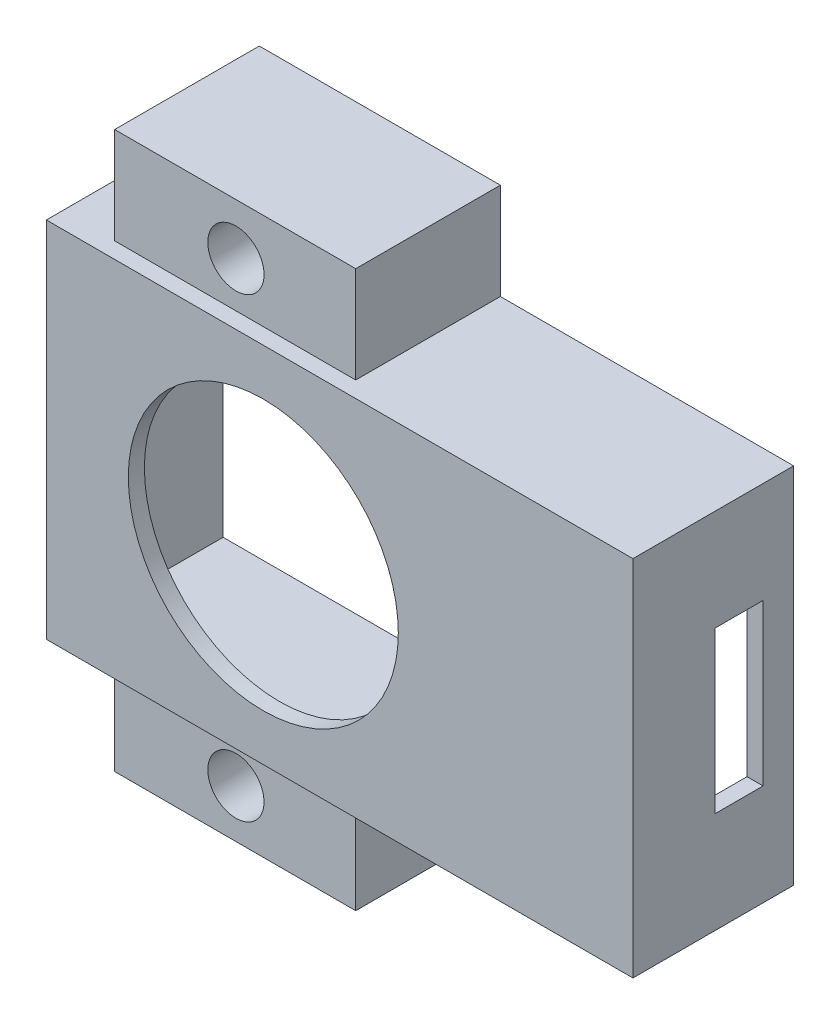
ISO-10303-21;
HEADER;
FILE_DESCRIPTION(('STEP AP214'),'2;1');
FILE_NAME('part.step','',(''),(''),'','','');
FILE_SCHEMA(('AUTOMOTIVE_DESIGN { 1 0 10303 214 1 1 1 1 }'));
ENDSEC;
DATA;
#1=APPLICATION_CONTEXT('core data for automotive mechanical design processes');
#2=APPLICATION_PROTOCOL_DEFINITION('international standard','automotive_design',2000,#1);
#3=PRODUCT_CONTEXT('',#1,'mechanical');
#4=PRODUCT('Part','Part','',(#3));
#5=PRODUCT_RELATED_PRODUCT_CATEGORY('part','',(#4));
#6=PRODUCT_DEFINITION_FORMATION('','',#4);
#7=PRODUCT_DEFINITION_CONTEXT('part definition',#1,'design');
#8=PRODUCT_DEFINITION('design','',#6,#7);
#9=PRODUCT_DEFINITION_SHAPE('','',#8);
#10=(LENGTH_UNIT() NAMED_UNIT(*) SI_UNIT(.MILLI.,.METRE.));
#11=(NAMED_UNIT(*) PLANE_ANGLE_UNIT() SI_UNIT($,.RADIAN.));
#12=(NAMED_UNIT(*) SI_UNIT($,.STERADIAN.) SOLID_ANGLE_UNIT());
#13=UNCERTAINTY_MEASURE_WITH_UNIT(LENGTH_MEASURE(1.E-05),#10,'distance_accuracy_value','');
#14=(GEOMETRIC_REPRESENTATION_CONTEXT(3) GLOBAL_UNCERTAINTY_ASSIGNED_CONTEXT((#13)) GLOBAL_UNIT_ASSIGNED_CONTEXT((#10,
#11,#12)) REPRESENTATION_CONTEXT('',''));
#15=CARTESIAN_POINT('',(0.,0.,0.));
#16=DIRECTION('',(0.,0.,1.));
#17=DIRECTION('',(1.,0.,0.));
#18=AXIS2_PLACEMENT_3D('',#15,#16,#17);
#19=CARTESIAN_POINT('',(0.,0.,0.));
#20=DIRECTION('',(0.,0.,-1.));
#21=DIRECTION('',(-1.,0.,0.));
#22=AXIS2_PLACEMENT_3D('',#19,#20,#21);
#23=PLANE('',#22);
#24=CARTESIAN_POINT('',(-7.45529442150943,14.124015169324,0.));
#25=DIRECTION('',(0.,0.,-1.));
#26=DIRECTION('',(-1.,0.,0.));
#27=AXIS2_PLACEMENT_3D('',#24,#25,#26);
#28=CIRCLE('',#27,1.75);
#29=CARTESIAN_POINT('',(-9.20529442150943,14.124015169324,0.));
#30=VERTEX_POINT('',#29);
#31=EDGE_CURVE('E390',#30,#30,#28,.T.);
#32=ORIENTED_EDGE('',*,*,#31,.F.);
#33=EDGE_LOOP('',(#32));
#34=FACE_BOUND('',#33,.T.);
#35=CARTESIAN_POINT('',(-7.45529442150943,-14.2961675918663,0.));
#36=DIRECTION('',(0.,0.,-1.));
#37=DIRECTION('',(-1.,0.,0.));
#38=AXIS2_PLACEMENT_3D('',#35,#36,#37);
#39=CIRCLE('',#38,1.75);
#40=CARTESIAN_POINT('',(-9.20529442150943,-14.2961675918663,0.));
#41=VERTEX_POINT('',#40);
#42=EDGE_CURVE('E397',#41,#41,#39,.T.);
#43=ORIENTED_EDGE('',*,*,#42,.F.);
#44=EDGE_LOOP('',(#43));
#45=FACE_BOUND('',#44,.T.);
#46=DIRECTION('',(0.,1.,0.));
#47=VECTOR('',#46,1.);
#48=CARTESIAN_POINT('',(18.25,-11.3,0.));
#49=LINE('',#48,#47);
#50=CARTESIAN_POINT('',(18.25,-11.3,0.));
#51=VERTEX_POINT('',#50);
#52=CARTESIAN_POINT('',(18.25,11.3,0.));
#53=VERTEX_POINT('',#52);
#54=EDGE_CURVE('E294',#51,#53,#49,.T.);
#55=ORIENTED_EDGE('',*,*,#54,.F.);
#56=DIRECTION('',(1.,0.,0.));
#57=VECTOR('',#56,1.);
#58=CARTESIAN_POINT('',(-18.25,-11.3,0.));
#59=LINE('',#58,#57);
#60=CARTESIAN_POINT('',(0.,-11.3,0.));
#61=VERTEX_POINT('',#60);
#62=EDGE_CURVE('E202',#61,#51,#59,.T.);
#63=ORIENTED_EDGE('',*,*,#62,.F.);
#64=DIRECTION('',(0.,-1.,0.));
#65=VECTOR('',#64,1.);
#66=CARTESIAN_POINT('',(0.,-11.3,0.));
#67=LINE('',#66,#65);
#68=CARTESIAN_POINT('',(0.,-17.3,0.));
#69=VERTEX_POINT('',#68);
#70=EDGE_CURVE('E189',#61,#69,#67,.T.);
#71=ORIENTED_EDGE('',*,*,#70,.T.);
#72=DIRECTION('',(-1.,0.,0.));
#73=VECTOR('',#72,1.);
#74=CARTESIAN_POINT('',(0.,-17.3,0.));
#75=LINE('',#74,#73);
#76=CARTESIAN_POINT('',(-15.,-17.3,0.));
#77=VERTEX_POINT('',#76);
#78=EDGE_CURVE('E177',#69,#77,#75,.T.);
#79=ORIENTED_EDGE('',*,*,#78,.T.);
#80=DIRECTION('',(0.,1.,0.));
#81=VECTOR('',#80,1.);
#82=CARTESIAN_POINT('',(-15.,-11.3,0.));
#83=LINE('',#82,#81);
#84=CARTESIAN_POINT('',(-15.,-11.3,0.));
#85=VERTEX_POINT('',#84);
#86=EDGE_CURVE('E188',#77,#85,#83,.T.);
#87=ORIENTED_EDGE('',*,*,#86,.T.);
#88=CARTESIAN_POINT('',(-18.25,-11.3,0.));
#89=VERTEX_POINT('',#88);
#90=EDGE_CURVE('E339',#89,#85,#59,.T.);
#91=ORIENTED_EDGE('',*,*,#90,.F.);
#92=DIRECTION('',(0.,-1.,0.));
#93=VECTOR('',#92,1.);
#94=CARTESIAN_POINT('',(-18.25,-11.3,0.));
#95=LINE('',#94,#93);
#96=CARTESIAN_POINT('',(-18.25,11.3,0.));
#97=VERTEX_POINT('',#96);
#98=EDGE_CURVE('E356',#97,#89,#95,.T.);
#99=ORIENTED_EDGE('',*,*,#98,.F.);
#100=DIRECTION('',(-1.,0.,0.));
#101=VECTOR('',#100,1.);
#102=CARTESIAN_POINT('',(-18.25,11.3,0.));
#103=LINE('',#102,#101);
#104=CARTESIAN_POINT('',(-15.,11.3,0.));
#105=VERTEX_POINT('',#104);
#106=EDGE_CURVE('E352',#105,#97,#103,.T.);
#107=ORIENTED_EDGE('',*,*,#106,.F.);
#108=DIRECTION('',(0.,1.,0.));
#109=VECTOR('',#108,1.);
#110=CARTESIAN_POINT('',(-15.,11.3,0.));
#111=LINE('',#110,#109);
#112=CARTESIAN_POINT('',(-15.,17.3,0.));
#113=VERTEX_POINT('',#112);
#114=EDGE_CURVE('E237',#105,#113,#111,.T.);
#115=ORIENTED_EDGE('',*,*,#114,.T.);
#116=DIRECTION('',(1.,0.,0.));
#117=VECTOR('',#116,1.);
#118=CARTESIAN_POINT('',(0.,17.3,0.));
#119=LINE('',#118,#117);
#120=CARTESIAN_POINT('',(0.,17.3,0.));
#121=VERTEX_POINT('',#120);
#122=EDGE_CURVE('E221',#113,#121,#119,.T.);
#123=ORIENTED_EDGE('',*,*,#122,.T.);
#124=DIRECTION('',(0.,-1.,0.));
#125=VECTOR('',#124,1.);
#126=CARTESIAN_POINT('',(0.,11.3,0.));
#127=LINE('',#126,#125);
#128=CARTESIAN_POINT('',(0.,11.3,0.));
#129=VERTEX_POINT('',#128);
#130=EDGE_CURVE('E242',#121,#129,#127,.T.);
#131=ORIENTED_EDGE('',*,*,#130,.T.);
#132=EDGE_CURVE('E353',#53,#129,#103,.T.);
#133=ORIENTED_EDGE('',*,*,#132,.F.);
#134=EDGE_LOOP('',(#55,#63,#71,#79,#87,#91,#99,#107,#115,#123,#131,#133));
#135=FACE_BOUND('',#134,.T.);
#136=DIRECTION('',(1.,0.,0.));
#137=VECTOR('',#136,1.);
#138=CARTESIAN_POINT('',(0.,-10.3,0.));
#139=LINE('',#138,#137);
#140=CARTESIAN_POINT('',(-17.25,-10.3,0.));
#141=VERTEX_POINT('',#140);
#142=CARTESIAN_POINT('',(17.25,-10.3,0.));
#143=VERTEX_POINT('',#142);
#144=EDGE_CURVE('E301',#141,#143,#139,.T.);
#145=ORIENTED_EDGE('',*,*,#144,.T.);
#146=DIRECTION('',(0.,1.,0.));
#147=VECTOR('',#146,1.);
#148=CARTESIAN_POINT('',(17.25,0.,0.));
#149=LINE('',#148,#147);
#150=CARTESIAN_POINT('',(17.25,10.3,0.));
#151=VERTEX_POINT('',#150);
#152=EDGE_CURVE('E319',#143,#151,#149,.T.);
#153=ORIENTED_EDGE('',*,*,#152,.T.);
#154=DIRECTION('',(-1.,0.,0.));
#155=VECTOR('',#154,1.);
#156=CARTESIAN_POINT('',(0.,10.3,0.));
#157=LINE('',#156,#155);
#158=CARTESIAN_POINT('',(-17.25,10.3,0.));
#159=VERTEX_POINT('',#158);
#160=EDGE_CURVE('E323',#151,#159,#157,.T.);
#161=ORIENTED_EDGE('',*,*,#160,.T.);
#162=DIRECTION('',(0.,-1.,0.));
#163=VECTOR('',#162,1.);
#164=CARTESIAN_POINT('',(-17.25,0.,0.));
#165=LINE('',#164,#163);
#166=EDGE_CURVE('E327',#159,#141,#165,.T.);
#167=ORIENTED_EDGE('',*,*,#166,.T.);
#168=EDGE_LOOP('',(#145,#153,#161,#167));
#169=FACE_BOUND('',#168,.T.);
#170=ADVANCED_FACE('F39',(#34,#45,#135,#169),#23,.T.);
#171=CARTESIAN_POINT('',(18.25,-11.3,10.));
#172=DIRECTION('',(-1.,0.,0.));
#173=DIRECTION('',(0.,0.,1.));
#174=AXIS2_PLACEMENT_3D('',#171,#172,#173);
#175=PLANE('',#174);
#176=DIRECTION('',(0.,0.,-1.));
#177=VECTOR('',#176,1.);
#178=CARTESIAN_POINT('',(18.25,-5.,1.9));
#179=LINE('',#178,#177);
#180=CARTESIAN_POINT('',(18.25,-5.,4.9));
#181=VERTEX_POINT('',#180);
#182=CARTESIAN_POINT('',(18.25,-5.,1.9));
#183=VERTEX_POINT('',#182);
#184=EDGE_CURVE('E260',#181,#183,#179,.T.);
#185=ORIENTED_EDGE('',*,*,#184,.F.);
#186=DIRECTION('',(0.,-1.,0.));
#187=VECTOR('',#186,1.);
#188=CARTESIAN_POINT('',(18.25,-5.,4.9));
#189=LINE('',#188,#187);
#190=CARTESIAN_POINT('',(18.25,5.,4.9));
#191=VERTEX_POINT('',#190);
#192=EDGE_CURVE('E241',#191,#181,#189,.T.);
#193=ORIENTED_EDGE('',*,*,#192,.F.);
#194=DIRECTION('',(0.,0.,1.));
#195=VECTOR('',#194,1.);
#196=CARTESIAN_POINT('',(18.25,5.,1.9));
#197=LINE('',#196,#195);
#198=CARTESIAN_POINT('',(18.25,5.,1.9));
#199=VERTEX_POINT('',#198);
#200=EDGE_CURVE('E268',#199,#191,#197,.T.);
#201=ORIENTED_EDGE('',*,*,#200,.F.);
#202=DIRECTION('',(0.,1.,0.));
#203=VECTOR('',#202,1.);
#204=CARTESIAN_POINT('',(18.25,-5.,1.9));
#205=LINE('',#204,#203);
#206=EDGE_CURVE('E264',#183,#199,#205,.T.);
#207=ORIENTED_EDGE('',*,*,#206,.F.);
#208=EDGE_LOOP('',(#185,#193,#201,#207));
#209=FACE_BOUND('',#208,.T.);
#210=ORIENTED_EDGE('',*,*,#54,.T.);
#211=DIRECTION('',(0.,0.,-1.));
#212=VECTOR('',#211,1.);
#213=CARTESIAN_POINT('',(18.25,11.3,10.));
#214=LINE('',#213,#212);
#215=CARTESIAN_POINT('',(18.25,11.3,10.));
#216=VERTEX_POINT('',#215);
#217=EDGE_CURVE('E372',#216,#53,#214,.T.);
#218=ORIENTED_EDGE('',*,*,#217,.F.);
#219=DIRECTION('',(0.,1.,0.));
#220=VECTOR('',#219,1.);
#221=CARTESIAN_POINT('',(18.25,-11.3,10.));
#222=LINE('',#221,#220);
#223=CARTESIAN_POINT('',(18.25,-11.3,10.));
#224=VERTEX_POINT('',#223);
#225=EDGE_CURVE('E334',#224,#216,#222,.T.);
#226=ORIENTED_EDGE('',*,*,#225,.F.);
#227=DIRECTION('',(0.,0.,-1.));
#228=VECTOR('',#227,1.);
#229=CARTESIAN_POINT('',(18.25,-11.3,10.));
#230=LINE('',#229,#228);
#231=EDGE_CURVE('E348',#224,#51,#230,.T.);
#232=ORIENTED_EDGE('',*,*,#231,.T.);
#233=EDGE_LOOP('',(#210,#218,#226,#232));
#234=FACE_BOUND('',#233,.T.);
#235=ADVANCED_FACE('F41',(#209,#234),#175,.F.);
#236=CARTESIAN_POINT('',(-18.25,11.3,10.));
#237=DIRECTION('',(0.,-1.,0.));
#238=DIRECTION('',(0.,0.,-1.));
#239=AXIS2_PLACEMENT_3D('',#236,#237,#238);
#240=PLANE('',#239);
#241=ORIENTED_EDGE('',*,*,#132,.T.);
#242=DIRECTION('',(0.,0.,1.));
#243=VECTOR('',#242,1.);
#244=CARTESIAN_POINT('',(0.,11.3,-16.1554944214035));
#245=LINE('',#244,#243);
#246=CARTESIAN_POINT('',(0.,11.3,9.));
#247=VERTEX_POINT('',#246);
#248=EDGE_CURVE('E231',#129,#247,#245,.T.);
#249=ORIENTED_EDGE('',*,*,#248,.T.);
#250=DIRECTION('',(-1.,0.,0.));
#251=VECTOR('',#250,1.);
#252=CARTESIAN_POINT('',(0.,11.3,9.));
#253=LINE('',#252,#251);
#254=CARTESIAN_POINT('',(-15.,11.3,9.));
#255=VERTEX_POINT('',#254);
#256=EDGE_CURVE('E228',#247,#255,#253,.T.);
#257=ORIENTED_EDGE('',*,*,#256,.T.);
#258=DIRECTION('',(0.,0.,1.));
#259=VECTOR('',#258,1.);
#260=CARTESIAN_POINT('',(-15.,11.3,-16.1554944214035));
#261=LINE('',#260,#259);
#262=EDGE_CURVE('E227',#105,#255,#261,.T.);
#263=ORIENTED_EDGE('',*,*,#262,.F.);
#264=ORIENTED_EDGE('',*,*,#106,.T.);
#265=DIRECTION('',(0.,0.,-1.));
#266=VECTOR('',#265,1.);
#267=CARTESIAN_POINT('',(-18.25,11.3,10.));
#268=LINE('',#267,#266);
#269=CARTESIAN_POINT('',(-18.25,11.3,10.));
#270=VERTEX_POINT('',#269);
#271=EDGE_CURVE('E368',#270,#97,#268,.T.);
#272=ORIENTED_EDGE('',*,*,#271,.F.);
#273=DIRECTION('',(-1.,0.,0.));
#274=VECTOR('',#273,1.);
#275=CARTESIAN_POINT('',(-18.25,11.3,10.));
#276=LINE('',#275,#274);
#277=EDGE_CURVE('E338',#216,#270,#276,.T.);
#278=ORIENTED_EDGE('',*,*,#277,.F.);
#279=ORIENTED_EDGE('',*,*,#217,.T.);
#280=EDGE_LOOP('',(#241,#249,#257,#263,#264,#272,#278,#279));
#281=FACE_BOUND('',#280,.T.);
#282=ADVANCED_FACE('F433',(#281),#240,.F.);
#283=CARTESIAN_POINT('',(-18.25,-11.3,10.));
#284=DIRECTION('',(1.,0.,0.));
#285=DIRECTION('',(0.,0.,-1.));
#286=AXIS2_PLACEMENT_3D('',#283,#284,#285);
#287=PLANE('',#286);
#288=ORIENTED_EDGE('',*,*,#98,.T.);
#289=DIRECTION('',(0.,0.,-1.));
#290=VECTOR('',#289,1.);
#291=CARTESIAN_POINT('',(-18.25,-11.3,10.));
#292=LINE('',#291,#290);
#293=CARTESIAN_POINT('',(-18.25,-11.3,10.));
#294=VERTEX_POINT('',#293);
#295=EDGE_CURVE('E364',#294,#89,#292,.T.);
#296=ORIENTED_EDGE('',*,*,#295,.F.);
#297=DIRECTION('',(0.,-1.,0.));
#298=VECTOR('',#297,1.);
#299=CARTESIAN_POINT('',(-18.25,-11.3,10.));
#300=LINE('',#299,#298);
#301=EDGE_CURVE('E342',#270,#294,#300,.T.);
#302=ORIENTED_EDGE('',*,*,#301,.F.);
#303=ORIENTED_EDGE('',*,*,#271,.T.);
#304=EDGE_LOOP('',(#288,#296,#302,#303));
#305=FACE_BOUND('',#304,.T.);
#306=ADVANCED_FACE('F422',(#305),#287,.F.);
#307=CARTESIAN_POINT('',(-18.25,-11.3,10.));
#308=DIRECTION('',(0.,1.,0.));
#309=DIRECTION('',(0.,0.,1.));
#310=AXIS2_PLACEMENT_3D('',#307,#308,#309);
#311=PLANE('',#310);
#312=ORIENTED_EDGE('',*,*,#90,.T.);
#313=DIRECTION('',(0.,0.,1.));
#314=VECTOR('',#313,1.);
#315=CARTESIAN_POINT('',(-15.,-11.3,-16.1554944214035));
#316=LINE('',#315,#314);
#317=CARTESIAN_POINT('',(-15.,-11.3,9.));
#318=VERTEX_POINT('',#317);
#319=EDGE_CURVE('E57',#85,#318,#316,.T.);
#320=ORIENTED_EDGE('',*,*,#319,.T.);
#321=DIRECTION('',(1.,0.,0.));
#322=VECTOR('',#321,1.);
#323=CARTESIAN_POINT('',(0.,-11.3,9.));
#324=LINE('',#323,#322);
#325=CARTESIAN_POINT('',(0.,-11.3,9.));
#326=VERTEX_POINT('',#325);
#327=EDGE_CURVE('E204',#318,#326,#324,.T.);
#328=ORIENTED_EDGE('',*,*,#327,.T.);
#329=DIRECTION('',(0.,0.,1.));
#330=VECTOR('',#329,1.);
#331=CARTESIAN_POINT('',(0.,-11.3,-16.1554944214035));
#332=LINE('',#331,#330);
#333=EDGE_CURVE('E63',#61,#326,#332,.T.);
#334=ORIENTED_EDGE('',*,*,#333,.F.);
#335=ORIENTED_EDGE('',*,*,#62,.T.);
#336=ORIENTED_EDGE('',*,*,#231,.F.);
#337=DIRECTION('',(1.,0.,0.));
#338=VECTOR('',#337,1.);
#339=CARTESIAN_POINT('',(-18.25,-11.3,10.));
#340=LINE('',#339,#338);
#341=EDGE_CURVE('E345',#294,#224,#340,.T.);
#342=ORIENTED_EDGE('',*,*,#341,.F.);
#343=ORIENTED_EDGE('',*,*,#295,.T.);
#344=EDGE_LOOP('',(#312,#320,#328,#334,#335,#336,#342,#343));
#345=FACE_BOUND('',#344,.T.);
#346=ADVANCED_FACE('F419',(#345),#311,.F.);
#347=CARTESIAN_POINT('',(0.,0.,10.));
#348=DIRECTION('',(0.,0.,-1.));
#349=DIRECTION('',(-1.,0.,0.));
#350=AXIS2_PLACEMENT_3D('',#347,#348,#349);
#351=PLANE('',#350);
#352=CARTESIAN_POINT('',(-4.75,0.,10.));
#353=DIRECTION('',(0.,0.,-1.));
#354=DIRECTION('',(-1.,0.,0.));
#355=AXIS2_PLACEMENT_3D('',#352,#353,#354);
#356=CIRCLE('',#355,8.4);
#357=CARTESIAN_POINT('',(-13.15,0.,10.));
#358=VERTEX_POINT('',#357);
#359=EDGE_CURVE('E289',#358,#358,#356,.T.);
#360=ORIENTED_EDGE('',*,*,#359,.T.);
#361=EDGE_LOOP('',(#360));
#362=FACE_BOUND('',#361,.T.);
#363=ORIENTED_EDGE('',*,*,#225,.T.);
#364=ORIENTED_EDGE('',*,*,#277,.T.);
#365=ORIENTED_EDGE('',*,*,#301,.T.);
#366=ORIENTED_EDGE('',*,*,#341,.T.);
#367=EDGE_LOOP('',(#363,#364,#365,#366));
#368=FACE_BOUND('',#367,.T.);
#369=ADVANCED_FACE('F421',(#362,#368),#351,.F.);
#370=CARTESIAN_POINT('',(17.25,-11.3,10.));
#371=DIRECTION('',(-1.,0.,0.));
#372=DIRECTION('',(0.,0.,1.));
#373=AXIS2_PLACEMENT_3D('',#370,#371,#372);
#374=PLANE('',#373);
#375=DIRECTION('',(0.,1.,0.));
#376=VECTOR('',#375,1.);
#377=CARTESIAN_POINT('',(17.25,-11.3,4.9));
#378=LINE('',#377,#376);
#379=CARTESIAN_POINT('',(17.25,-5.,4.9));
#380=VERTEX_POINT('',#379);
#381=CARTESIAN_POINT('',(17.25,5.,4.9));
#382=VERTEX_POINT('',#381);
#383=EDGE_CURVE('E11',#380,#382,#378,.T.);
#384=ORIENTED_EDGE('',*,*,#383,.F.);
#385=DIRECTION('',(0.,0.,1.));
#386=VECTOR('',#385,1.);
#387=CARTESIAN_POINT('',(17.25,-5.,10.));
#388=LINE('',#387,#386);
#389=CARTESIAN_POINT('',(17.25,-5.,1.9));
#390=VERTEX_POINT('',#389);
#391=EDGE_CURVE('E376',#390,#380,#388,.T.);
#392=ORIENTED_EDGE('',*,*,#391,.F.);
#393=DIRECTION('',(0.,-1.,0.));
#394=VECTOR('',#393,1.);
#395=CARTESIAN_POINT('',(17.25,-11.3,1.9));
#396=LINE('',#395,#394);
#397=CARTESIAN_POINT('',(17.25,5.,1.9));
#398=VERTEX_POINT('',#397);
#399=EDGE_CURVE('E382',#398,#390,#396,.T.);
#400=ORIENTED_EDGE('',*,*,#399,.F.);
#401=DIRECTION('',(0.,0.,-1.));
#402=VECTOR('',#401,1.);
#403=CARTESIAN_POINT('',(17.25,5.,10.));
#404=LINE('',#403,#402);
#405=EDGE_CURVE('E49',#382,#398,#404,.T.);
#406=ORIENTED_EDGE('',*,*,#405,.F.);
#407=EDGE_LOOP('',(#384,#392,#400,#406));
#408=FACE_BOUND('',#407,.T.);
#409=ORIENTED_EDGE('',*,*,#152,.F.);
#410=DIRECTION('',(0.,0.,-1.));
#411=VECTOR('',#410,1.);
#412=CARTESIAN_POINT('',(17.25,-10.3,10.));
#413=LINE('',#412,#411);
#414=CARTESIAN_POINT('',(17.25,-10.3,9.));
#415=VERTEX_POINT('',#414);
#416=EDGE_CURVE('E302',#415,#143,#413,.T.);
#417=ORIENTED_EDGE('',*,*,#416,.F.);
#418=DIRECTION('',(0.,1.,0.));
#419=VECTOR('',#418,1.);
#420=CARTESIAN_POINT('',(17.25,0.,9.));
#421=LINE('',#420,#419);
#422=CARTESIAN_POINT('',(17.25,10.3,9.));
#423=VERTEX_POINT('',#422);
#424=EDGE_CURVE('E296',#415,#423,#421,.T.);
#425=ORIENTED_EDGE('',*,*,#424,.T.);
#426=DIRECTION('',(0.,0.,-1.));
#427=VECTOR('',#426,1.);
#428=CARTESIAN_POINT('',(17.25,10.3,10.));
#429=LINE('',#428,#427);
#430=EDGE_CURVE('E290',#423,#151,#429,.T.);
#431=ORIENTED_EDGE('',*,*,#430,.T.);
#432=EDGE_LOOP('',(#409,#417,#425,#431));
#433=FACE_BOUND('',#432,.T.);
#434=ADVANCED_FACE('F429',(#408,#433),#374,.T.);
#435=CARTESIAN_POINT('',(-18.25,10.3,10.));
#436=DIRECTION('',(0.,-1.,0.));
#437=DIRECTION('',(0.,0.,-1.));
#438=AXIS2_PLACEMENT_3D('',#435,#436,#437);
#439=PLANE('',#438);
#440=ORIENTED_EDGE('',*,*,#160,.F.);
#441=ORIENTED_EDGE('',*,*,#430,.F.);
#442=DIRECTION('',(-1.,0.,0.));
#443=VECTOR('',#442,1.);
#444=CARTESIAN_POINT('',(0.,10.3,9.));
#445=LINE('',#444,#443);
#446=CARTESIAN_POINT('',(-17.25,10.3,9.));
#447=VERTEX_POINT('',#446);
#448=EDGE_CURVE('E300',#423,#447,#445,.T.);
#449=ORIENTED_EDGE('',*,*,#448,.T.);
#450=DIRECTION('',(0.,0.,-1.));
#451=VECTOR('',#450,1.);
#452=CARTESIAN_POINT('',(-17.25,10.3,10.));
#453=LINE('',#452,#451);
#454=EDGE_CURVE('E295',#447,#159,#453,.T.);
#455=ORIENTED_EDGE('',*,*,#454,.T.);
#456=EDGE_LOOP('',(#440,#441,#449,#455));
#457=FACE_BOUND('',#456,.T.);
#458=ADVANCED_FACE('F459',(#457),#439,.T.);
#459=CARTESIAN_POINT('',(-17.25,-11.3,10.));
#460=DIRECTION('',(1.,0.,0.));
#461=DIRECTION('',(0.,0.,-1.));
#462=AXIS2_PLACEMENT_3D('',#459,#460,#461);
#463=PLANE('',#462);
#464=ORIENTED_EDGE('',*,*,#166,.F.);
#465=ORIENTED_EDGE('',*,*,#454,.F.);
#466=DIRECTION('',(0.,-1.,0.));
#467=VECTOR('',#466,1.);
#468=CARTESIAN_POINT('',(-17.25,0.,9.));
#469=LINE('',#468,#467);
#470=CARTESIAN_POINT('',(-17.25,-10.3,9.));
#471=VERTEX_POINT('',#470);
#472=EDGE_CURVE('E312',#447,#471,#469,.T.);
#473=ORIENTED_EDGE('',*,*,#472,.T.);
#474=DIRECTION('',(0.,0.,-1.));
#475=VECTOR('',#474,1.);
#476=CARTESIAN_POINT('',(-17.25,-10.3,10.));
#477=LINE('',#476,#475);
#478=EDGE_CURVE('E305',#471,#141,#477,.T.);
#479=ORIENTED_EDGE('',*,*,#478,.T.);
#480=EDGE_LOOP('',(#464,#465,#473,#479));
#481=FACE_BOUND('',#480,.T.);
#482=ADVANCED_FACE('F455',(#481),#463,.T.);
#483=CARTESIAN_POINT('',(-18.25,-10.3,10.));
#484=DIRECTION('',(0.,1.,0.));
#485=DIRECTION('',(0.,0.,1.));
#486=AXIS2_PLACEMENT_3D('',#483,#484,#485);
#487=PLANE('',#486);
#488=ORIENTED_EDGE('',*,*,#144,.F.);
#489=ORIENTED_EDGE('',*,*,#478,.F.);
#490=DIRECTION('',(1.,0.,0.));
#491=VECTOR('',#490,1.);
#492=CARTESIAN_POINT('',(0.,-10.3,9.));
#493=LINE('',#492,#491);
#494=EDGE_CURVE('E306',#471,#415,#493,.T.);
#495=ORIENTED_EDGE('',*,*,#494,.T.);
#496=ORIENTED_EDGE('',*,*,#416,.T.);
#497=EDGE_LOOP('',(#488,#489,#495,#496));
#498=FACE_BOUND('',#497,.T.);
#499=ADVANCED_FACE('F451',(#498),#487,.T.);
#500=CARTESIAN_POINT('',(0.,0.,9.));
#501=DIRECTION('',(0.,0.,-1.));
#502=DIRECTION('',(-1.,0.,0.));
#503=AXIS2_PLACEMENT_3D('',#500,#501,#502);
#504=PLANE('',#503);
#505=CARTESIAN_POINT('',(-4.75,0.,9.));
#506=DIRECTION('',(0.,0.,-1.));
#507=DIRECTION('',(-1.,0.,0.));
#508=AXIS2_PLACEMENT_3D('',#505,#506,#507);
#509=CIRCLE('',#508,8.4);
#510=CARTESIAN_POINT('',(-13.15,0.,9.));
#511=VERTEX_POINT('',#510);
#512=EDGE_CURVE('E276',#511,#511,#509,.T.);
#513=ORIENTED_EDGE('',*,*,#512,.F.);
#514=EDGE_LOOP('',(#513));
#515=FACE_BOUND('',#514,.T.);
#516=ORIENTED_EDGE('',*,*,#424,.F.);
#517=ORIENTED_EDGE('',*,*,#494,.F.);
#518=ORIENTED_EDGE('',*,*,#472,.F.);
#519=ORIENTED_EDGE('',*,*,#448,.F.);
#520=EDGE_LOOP('',(#516,#517,#518,#519));
#521=FACE_BOUND('',#520,.T.);
#522=ADVANCED_FACE('F447',(#515,#521),#504,.T.);
#523=CARTESIAN_POINT('',(-4.75,0.,19.));
#524=DIRECTION('',(0.,0.,-1.));
#525=DIRECTION('',(-1.,0.,0.));
#526=AXIS2_PLACEMENT_3D('',#523,#524,#525);
#527=CYLINDRICAL_SURFACE('',#526,8.4);
#528=ORIENTED_EDGE('',*,*,#512,.T.);
#529=EDGE_LOOP('',(#528));
#530=FACE_BOUND('',#529,.T.);
#531=ORIENTED_EDGE('',*,*,#359,.F.);
#532=EDGE_LOOP('',(#531));
#533=FACE_BOUND('',#532,.T.);
#534=ADVANCED_FACE('F450',(#530,#533),#527,.F.);
#535=CARTESIAN_POINT('',(8.25,-5.,4.9));
#536=DIRECTION('',(0.,0.,1.));
#537=DIRECTION('',(0.,-1.,0.));
#538=AXIS2_PLACEMENT_3D('',#535,#536,#537);
#539=PLANE('',#538);
#540=ORIENTED_EDGE('',*,*,#383,.T.);
#541=DIRECTION('',(1.,0.,0.));
#542=VECTOR('',#541,1.);
#543=CARTESIAN_POINT('',(8.25,5.,4.9));
#544=LINE('',#543,#542);
#545=EDGE_CURVE('E273',#382,#191,#544,.T.);
#546=ORIENTED_EDGE('',*,*,#545,.T.);
#547=ORIENTED_EDGE('',*,*,#192,.T.);
#548=DIRECTION('',(1.,0.,0.));
#549=VECTOR('',#548,1.);
#550=CARTESIAN_POINT('',(8.25,-5.,4.9));
#551=LINE('',#550,#549);
#552=EDGE_CURVE('E272',#380,#181,#551,.T.);
#553=ORIENTED_EDGE('',*,*,#552,.F.);
#554=EDGE_LOOP('',(#540,#546,#547,#553));
#555=FACE_BOUND('',#554,.T.);
#556=ADVANCED_FACE('F469',(#555),#539,.F.);
#557=CARTESIAN_POINT('',(8.25,5.,1.9));
#558=DIRECTION('',(0.,1.,0.));
#559=DIRECTION('',(0.,0.,1.));
#560=AXIS2_PLACEMENT_3D('',#557,#558,#559);
#561=PLANE('',#560);
#562=ORIENTED_EDGE('',*,*,#405,.T.);
#563=DIRECTION('',(1.,0.,0.));
#564=VECTOR('',#563,1.);
#565=CARTESIAN_POINT('',(8.25,5.,1.9));
#566=LINE('',#565,#564);
#567=EDGE_CURVE('E277',#398,#199,#566,.T.);
#568=ORIENTED_EDGE('',*,*,#567,.T.);
#569=ORIENTED_EDGE('',*,*,#200,.T.);
#570=ORIENTED_EDGE('',*,*,#545,.F.);
#571=EDGE_LOOP('',(#562,#568,#569,#570));
#572=FACE_BOUND('',#571,.T.);
#573=ADVANCED_FACE('F473',(#572),#561,.F.);
#574=CARTESIAN_POINT('',(8.25,-5.,1.9));
#575=DIRECTION('',(0.,0.,-1.));
#576=DIRECTION('',(0.,1.,0.));
#577=AXIS2_PLACEMENT_3D('',#574,#575,#576);
#578=PLANE('',#577);
#579=ORIENTED_EDGE('',*,*,#399,.T.);
#580=DIRECTION('',(1.,0.,0.));
#581=VECTOR('',#580,1.);
#582=CARTESIAN_POINT('',(8.25,-5.,1.9));
#583=LINE('',#582,#581);
#584=EDGE_CURVE('E280',#390,#183,#583,.T.);
#585=ORIENTED_EDGE('',*,*,#584,.T.);
#586=ORIENTED_EDGE('',*,*,#206,.T.);
#587=ORIENTED_EDGE('',*,*,#567,.F.);
#588=EDGE_LOOP('',(#579,#585,#586,#587));
#589=FACE_BOUND('',#588,.T.);
#590=ADVANCED_FACE('F478',(#589),#578,.F.);
#591=CARTESIAN_POINT('',(8.25,-5.,1.9));
#592=DIRECTION('',(0.,-1.,0.));
#593=DIRECTION('',(0.,0.,-1.));
#594=AXIS2_PLACEMENT_3D('',#591,#592,#593);
#595=PLANE('',#594);
#596=ORIENTED_EDGE('',*,*,#391,.T.);
#597=ORIENTED_EDGE('',*,*,#552,.T.);
#598=ORIENTED_EDGE('',*,*,#184,.T.);
#599=ORIENTED_EDGE('',*,*,#584,.F.);
#600=EDGE_LOOP('',(#596,#597,#598,#599));
#601=FACE_BOUND('',#600,.T.);
#602=ADVANCED_FACE('F475',(#601),#595,.F.);
#603=CARTESIAN_POINT('',(0.,11.3,-16.1554944214035));
#604=DIRECTION('',(-1.,0.,0.));
#605=DIRECTION('',(0.,0.,1.));
#606=AXIS2_PLACEMENT_3D('',#603,#604,#605);
#607=PLANE('',#606);
#608=ORIENTED_EDGE('',*,*,#130,.F.);
#609=DIRECTION('',(0.,0.,1.));
#610=VECTOR('',#609,1.);
#611=CARTESIAN_POINT('',(0.,17.3,-16.1554944214035));
#612=LINE('',#611,#610);
#613=CARTESIAN_POINT('',(0.,17.3,9.));
#614=VERTEX_POINT('',#613);
#615=EDGE_CURVE('E236',#121,#614,#612,.T.);
#616=ORIENTED_EDGE('',*,*,#615,.T.);
#617=DIRECTION('',(0.,-1.,0.));
#618=VECTOR('',#617,1.);
#619=CARTESIAN_POINT('',(0.,11.3,9.));
#620=LINE('',#619,#618);
#621=EDGE_CURVE('E232',#614,#247,#620,.T.);
#622=ORIENTED_EDGE('',*,*,#621,.T.);
#623=ORIENTED_EDGE('',*,*,#248,.F.);
#624=EDGE_LOOP('',(#608,#616,#622,#623));
#625=FACE_BOUND('',#624,.T.);
#626=ADVANCED_FACE('F477',(#625),#607,.F.);
#627=CARTESIAN_POINT('',(-15.,11.3,-16.1554944214035));
#628=DIRECTION('',(1.,0.,0.));
#629=DIRECTION('',(0.,0.,-1.));
#630=AXIS2_PLACEMENT_3D('',#627,#628,#629);
#631=PLANE('',#630);
#632=ORIENTED_EDGE('',*,*,#114,.F.);
#633=ORIENTED_EDGE('',*,*,#262,.T.);
#634=DIRECTION('',(0.,1.,0.));
#635=VECTOR('',#634,1.);
#636=CARTESIAN_POINT('',(-15.,11.3,9.));
#637=LINE('',#636,#635);
#638=CARTESIAN_POINT('',(-15.,17.3,9.));
#639=VERTEX_POINT('',#638);
#640=EDGE_CURVE('E223',#255,#639,#637,.T.);
#641=ORIENTED_EDGE('',*,*,#640,.T.);
#642=DIRECTION('',(0.,0.,1.));
#643=VECTOR('',#642,1.);
#644=CARTESIAN_POINT('',(-15.,17.3,-16.1554944214035));
#645=LINE('',#644,#643);
#646=EDGE_CURVE('E222',#113,#639,#645,.T.);
#647=ORIENTED_EDGE('',*,*,#646,.F.);
#648=EDGE_LOOP('',(#632,#633,#641,#647));
#649=FACE_BOUND('',#648,.T.);
#650=ADVANCED_FACE('F487',(#649),#631,.F.);
#651=CARTESIAN_POINT('',(0.,17.3,-16.1554944214035));
#652=DIRECTION('',(0.,-1.,0.));
#653=DIRECTION('',(0.,0.,-1.));
#654=AXIS2_PLACEMENT_3D('',#651,#652,#653);
#655=PLANE('',#654);
#656=ORIENTED_EDGE('',*,*,#122,.F.);
#657=ORIENTED_EDGE('',*,*,#646,.T.);
#658=DIRECTION('',(1.,0.,0.));
#659=VECTOR('',#658,1.);
#660=CARTESIAN_POINT('',(0.,17.3,9.));
#661=LINE('',#660,#659);
#662=EDGE_CURVE('E217',#639,#614,#661,.T.);
#663=ORIENTED_EDGE('',*,*,#662,.T.);
#664=ORIENTED_EDGE('',*,*,#615,.F.);
#665=EDGE_LOOP('',(#656,#657,#663,#664));
#666=FACE_BOUND('',#665,.T.);
#667=ADVANCED_FACE('F491',(#666),#655,.F.);
#668=CARTESIAN_POINT('',(0.,0.,9.));
#669=DIRECTION('',(0.,0.,1.));
#670=DIRECTION('',(1.,0.,0.));
#671=AXIS2_PLACEMENT_3D('',#668,#669,#670);
#672=PLANE('',#671);
#673=CARTESIAN_POINT('',(-7.45529442150943,14.124015169324,9.));
#674=DIRECTION('',(0.,0.,1.));
#675=DIRECTION('',(1.,0.,0.));
#676=AXIS2_PLACEMENT_3D('',#673,#674,#675);
#677=CIRCLE('',#676,1.75);
#678=CARTESIAN_POINT('',(-5.70529442150943,14.124015169324,9.));
#679=VERTEX_POINT('',#678);
#680=EDGE_CURVE('E43',#679,#679,#677,.T.);
#681=ORIENTED_EDGE('',*,*,#680,.F.);
#682=EDGE_LOOP('',(#681));
#683=FACE_BOUND('',#682,.T.);
#684=ORIENTED_EDGE('',*,*,#621,.F.);
#685=ORIENTED_EDGE('',*,*,#662,.F.);
#686=ORIENTED_EDGE('',*,*,#640,.F.);
#687=ORIENTED_EDGE('',*,*,#256,.F.);
#688=EDGE_LOOP('',(#684,#685,#686,#687));
#689=FACE_BOUND('',#688,.T.);
#690=ADVANCED_FACE('F495',(#683,#689),#672,.T.);
#691=CARTESIAN_POINT('',(0.,-11.3,-16.1554944214035));
#692=DIRECTION('',(-1.,0.,0.));
#693=DIRECTION('',(0.,-1.,0.));
#694=AXIS2_PLACEMENT_3D('',#691,#692,#693);
#695=PLANE('',#694);
#696=ORIENTED_EDGE('',*,*,#70,.F.);
#697=ORIENTED_EDGE('',*,*,#333,.T.);
#698=DIRECTION('',(0.,-1.,0.));
#699=VECTOR('',#698,1.);
#700=CARTESIAN_POINT('',(0.,-11.3,9.));
#701=LINE('',#700,#699);
#702=CARTESIAN_POINT('',(0.,-17.3,9.));
#703=VERTEX_POINT('',#702);
#704=EDGE_CURVE('E196',#326,#703,#701,.T.);
#705=ORIENTED_EDGE('',*,*,#704,.T.);
#706=DIRECTION('',(0.,0.,1.));
#707=VECTOR('',#706,1.);
#708=CARTESIAN_POINT('',(0.,-17.3,-16.1554944214035));
#709=LINE('',#708,#707);
#710=EDGE_CURVE('E181',#69,#703,#709,.T.);
#711=ORIENTED_EDGE('',*,*,#710,.F.);
#712=EDGE_LOOP('',(#696,#697,#705,#711));
#713=FACE_BOUND('',#712,.T.);
#714=ADVANCED_FACE('F194',(#713),#695,.F.);
#715=CARTESIAN_POINT('',(0.,-17.3,-16.1554944214035));
#716=DIRECTION('',(0.,1.,0.));
#717=DIRECTION('',(0.,0.,1.));
#718=AXIS2_PLACEMENT_3D('',#715,#716,#717);
#719=PLANE('',#718);
#720=ORIENTED_EDGE('',*,*,#78,.F.);
#721=ORIENTED_EDGE('',*,*,#710,.T.);
#722=DIRECTION('',(-1.,0.,0.));
#723=VECTOR('',#722,1.);
#724=CARTESIAN_POINT('',(0.,-17.3,9.));
#725=LINE('',#724,#723);
#726=CARTESIAN_POINT('',(-15.,-17.3,9.));
#727=VERTEX_POINT('',#726);
#728=EDGE_CURVE('E198',#703,#727,#725,.T.);
#729=ORIENTED_EDGE('',*,*,#728,.T.);
#730=DIRECTION('',(0.,0.,1.));
#731=VECTOR('',#730,1.);
#732=CARTESIAN_POINT('',(-15.,-17.3,-16.1554944214035));
#733=LINE('',#732,#731);
#734=EDGE_CURVE('E183',#77,#727,#733,.T.);
#735=ORIENTED_EDGE('',*,*,#734,.F.);
#736=EDGE_LOOP('',(#720,#721,#729,#735));
#737=FACE_BOUND('',#736,.T.);
#738=ADVANCED_FACE('F179',(#737),#719,.F.);
#739=CARTESIAN_POINT('',(-15.,-11.3,-16.1554944214035));
#740=DIRECTION('',(1.,0.,0.));
#741=DIRECTION('',(0.,0.,-1.));
#742=AXIS2_PLACEMENT_3D('',#739,#740,#741);
#743=PLANE('',#742);
#744=ORIENTED_EDGE('',*,*,#86,.F.);
#745=ORIENTED_EDGE('',*,*,#734,.T.);
#746=DIRECTION('',(0.,1.,0.));
#747=VECTOR('',#746,1.);
#748=CARTESIAN_POINT('',(-15.,-11.3,9.));
#749=LINE('',#748,#747);
#750=EDGE_CURVE('E212',#727,#318,#749,.T.);
#751=ORIENTED_EDGE('',*,*,#750,.T.);
#752=ORIENTED_EDGE('',*,*,#319,.F.);
#753=EDGE_LOOP('',(#744,#745,#751,#752));
#754=FACE_BOUND('',#753,.T.);
#755=ADVANCED_FACE('F414',(#754),#743,.F.);
#756=CARTESIAN_POINT('',(0.,0.,9.));
#757=DIRECTION('',(0.,0.,-1.));
#758=DIRECTION('',(-1.,0.,0.));
#759=AXIS2_PLACEMENT_3D('',#756,#757,#758);
#760=PLANE('',#759);
#761=CARTESIAN_POINT('',(-7.45529442150943,-14.2961675918663,9.));
#762=DIRECTION('',(0.,0.,-1.));
#763=DIRECTION('',(-1.,0.,0.));
#764=AXIS2_PLACEMENT_3D('',#761,#762,#763);
#765=CIRCLE('',#764,1.75);
#766=CARTESIAN_POINT('',(-9.20529442150943,-14.2961675918663,9.));
#767=VERTEX_POINT('',#766);
#768=EDGE_CURVE('E387',#767,#767,#765,.T.);
#769=ORIENTED_EDGE('',*,*,#768,.T.);
#770=EDGE_LOOP('',(#769));
#771=FACE_BOUND('',#770,.T.);
#772=ORIENTED_EDGE('',*,*,#704,.F.);
#773=ORIENTED_EDGE('',*,*,#327,.F.);
#774=ORIENTED_EDGE('',*,*,#750,.F.);
#775=ORIENTED_EDGE('',*,*,#728,.F.);
#776=EDGE_LOOP('',(#772,#773,#774,#775));
#777=FACE_BOUND('',#776,.T.);
#778=ADVANCED_FACE('F418',(#771,#777),#760,.F.);
#779=CARTESIAN_POINT('',(-7.45529442150943,-14.2961675918663,18.));
#780=DIRECTION('',(0.,0.,-1.));
#781=DIRECTION('',(-1.,0.,0.));
#782=AXIS2_PLACEMENT_3D('',#779,#780,#781);
#783=CYLINDRICAL_SURFACE('',#782,1.75);
#784=ORIENTED_EDGE('',*,*,#42,.T.);
#785=EDGE_LOOP('',(#784));
#786=FACE_BOUND('',#785,.T.);
#787=ORIENTED_EDGE('',*,*,#768,.F.);
#788=EDGE_LOOP('',(#787));
#789=FACE_BOUND('',#788,.T.);
#790=ADVANCED_FACE('F508',(#786,#789),#783,.F.);
#791=CARTESIAN_POINT('',(-7.45529442150943,14.124015169324,18.));
#792=DIRECTION('',(0.,0.,-1.));
#793=DIRECTION('',(-1.,0.,0.));
#794=AXIS2_PLACEMENT_3D('',#791,#792,#793);
#795=CYLINDRICAL_SURFACE('',#794,1.75);
#796=ORIENTED_EDGE('',*,*,#680,.T.);
#797=EDGE_LOOP('',(#796));
#798=FACE_BOUND('',#797,.T.);
#799=ORIENTED_EDGE('',*,*,#31,.T.);
#800=EDGE_LOOP('',(#799));
#801=FACE_BOUND('',#800,.T.);
#802=ADVANCED_FACE('F511',(#798,#801),#795,.F.);
#803=CLOSED_SHELL('',(#170,#235,#282,#306,#346,#369,#434,#458,#482,#499,#522,#534,#556,#573,
#590,#602,#626,#650,#667,#690,#714,#738,#755,#778,#790,#802));
#804=MANIFOLD_SOLID_BREP('B2',#803);
#805=ADVANCED_BREP_SHAPE_REPRESENTATION('',(#18,#804),#14);
#806=SHAPE_DEFINITION_REPRESENTATION(#9,#805);
ENDSEC;
END-ISO-10303-21;
